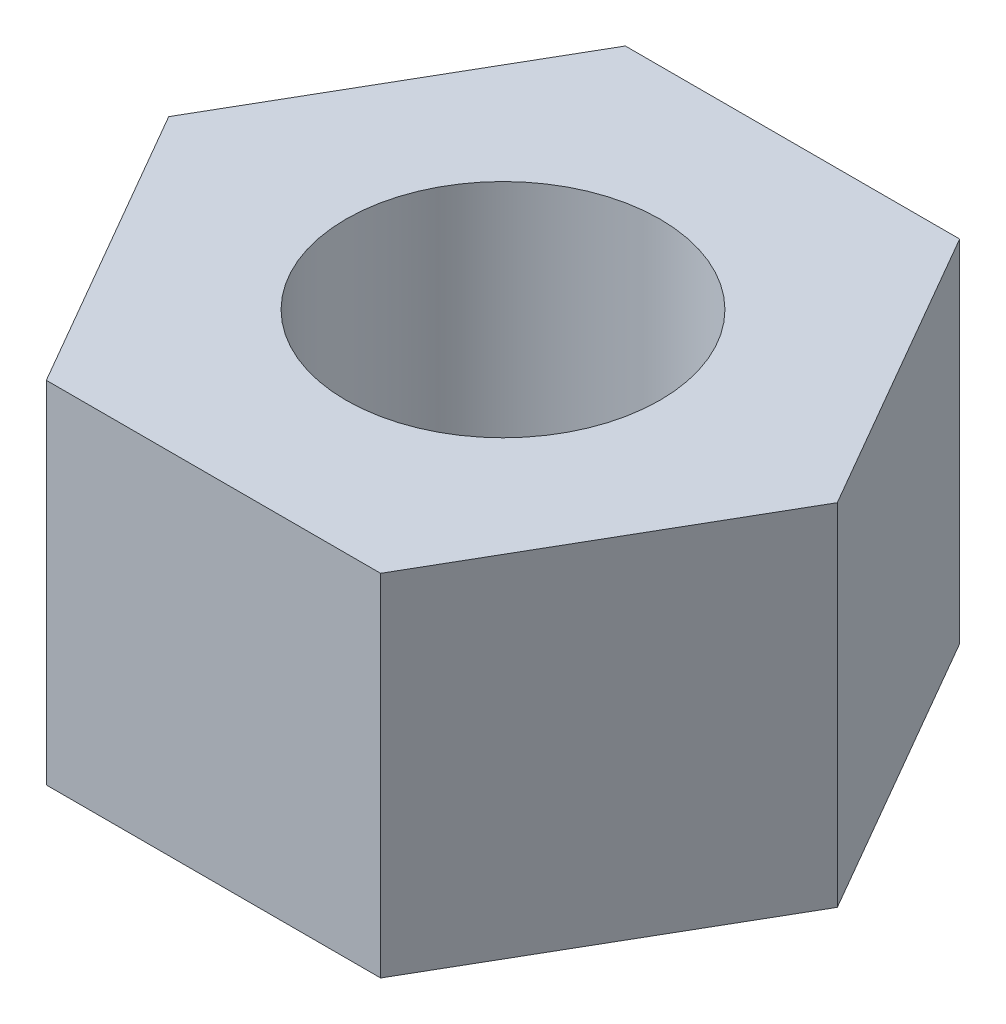
ISO-10303-21;
HEADER;
FILE_DESCRIPTION(('STEP AP214'),'2;1');
FILE_NAME('part.step','',(''),(''),'','','');
FILE_SCHEMA(('AUTOMOTIVE_DESIGN { 1 0 10303 214 1 1 1 1 }'));
ENDSEC;
DATA;
#1=APPLICATION_CONTEXT('core data for automotive mechanical design processes');
#2=APPLICATION_PROTOCOL_DEFINITION('international standard','automotive_design',2000,#1);
#3=PRODUCT_CONTEXT('',#1,'mechanical');
#4=PRODUCT('Part','Part','',(#3));
#5=PRODUCT_RELATED_PRODUCT_CATEGORY('part','',(#4));
#6=PRODUCT_DEFINITION_FORMATION('','',#4);
#7=PRODUCT_DEFINITION_CONTEXT('part definition',#1,'design');
#8=PRODUCT_DEFINITION('design','',#6,#7);
#9=PRODUCT_DEFINITION_SHAPE('','',#8);
#10=(LENGTH_UNIT() NAMED_UNIT(*) SI_UNIT(.MILLI.,.METRE.));
#11=(NAMED_UNIT(*) PLANE_ANGLE_UNIT() SI_UNIT($,.RADIAN.));
#12=(NAMED_UNIT(*) SI_UNIT($,.STERADIAN.) SOLID_ANGLE_UNIT());
#13=UNCERTAINTY_MEASURE_WITH_UNIT(LENGTH_MEASURE(1.E-05),#10,'distance_accuracy_value','');
#14=(GEOMETRIC_REPRESENTATION_CONTEXT(3) GLOBAL_UNCERTAINTY_ASSIGNED_CONTEXT((#13)) GLOBAL_UNIT_ASSIGNED_CONTEXT((#10,
#11,#12)) REPRESENTATION_CONTEXT('',''));
#15=CARTESIAN_POINT('',(0.,0.,0.));
#16=DIRECTION('',(0.,0.,1.));
#17=DIRECTION('',(1.,0.,0.));
#18=AXIS2_PLACEMENT_3D('',#15,#16,#17);
#19=CARTESIAN_POINT('',(0.,11.5,0.));
#20=DIRECTION('',(0.,1.,0.));
#21=DIRECTION('',(0.,0.,1.));
#22=AXIS2_PLACEMENT_3D('',#19,#20,#21);
#23=PLANE('',#22);
#24=DIRECTION('',(0.499999999999995,0.,-0.866025403784441));
#25=VECTOR('',#24,1.);
#26=CARTESIAN_POINT('',(5.48482755730154,11.5,9.4999999999999));
#27=LINE('',#26,#25);
#28=CARTESIAN_POINT('',(5.48482755730154,11.5,9.4999999999999));
#29=VERTEX_POINT('',#28);
#30=CARTESIAN_POINT('',(10.9696551146029,11.5,0.));
#31=VERTEX_POINT('',#30);
#32=EDGE_CURVE('E129',#29,#31,#27,.T.);
#33=ORIENTED_EDGE('',*,*,#32,.T.);
#34=DIRECTION('',(-0.500000000000001,0.,-0.866025403784438));
#35=VECTOR('',#34,1.);
#36=CARTESIAN_POINT('',(10.9696551146029,11.5,0.));
#37=LINE('',#36,#35);
#38=CARTESIAN_POINT('',(5.4848275573014,11.5,-9.49999999999998));
#39=VERTEX_POINT('',#38);
#40=EDGE_CURVE('E87',#31,#39,#37,.T.);
#41=ORIENTED_EDGE('',*,*,#40,.T.);
#42=DIRECTION('',(-1.,0.,0.));
#43=VECTOR('',#42,1.);
#44=CARTESIAN_POINT('',(5.4848275573014,11.5,-9.49999999999998));
#45=LINE('',#44,#43);
#46=CARTESIAN_POINT('',(-5.48482755730147,11.5,-9.49999999999994));
#47=VERTEX_POINT('',#46);
#48=EDGE_CURVE('E100',#39,#47,#45,.T.);
#49=ORIENTED_EDGE('',*,*,#48,.T.);
#50=DIRECTION('',(-0.499999999999995,0.,0.866025403784442));
#51=VECTOR('',#50,1.);
#52=CARTESIAN_POINT('',(-5.48482755730147,11.5,-9.49999999999994));
#53=LINE('',#52,#51);
#54=CARTESIAN_POINT('',(-10.9696551146028,11.5,0.));
#55=VERTEX_POINT('',#54);
#56=EDGE_CURVE('E94',#47,#55,#53,.T.);
#57=ORIENTED_EDGE('',*,*,#56,.T.);
#58=DIRECTION('',(0.500000000000007,0.,0.866025403784435));
#59=VECTOR('',#58,1.);
#60=CARTESIAN_POINT('',(-10.9696551146028,11.5,0.));
#61=LINE('',#60,#59);
#62=CARTESIAN_POINT('',(-5.48482755730134,11.5,9.50000000000002));
#63=VERTEX_POINT('',#62);
#64=EDGE_CURVE('E98',#55,#63,#61,.T.);
#65=ORIENTED_EDGE('',*,*,#64,.T.);
#66=DIRECTION('',(1.,0.,0.));
#67=VECTOR('',#66,1.);
#68=CARTESIAN_POINT('',(-5.48482755730134,11.5,9.50000000000002));
#69=LINE('',#68,#67);
#70=EDGE_CURVE('E50',#63,#29,#69,.T.);
#71=ORIENTED_EDGE('',*,*,#70,.T.);
#72=EDGE_LOOP('',(#33,#41,#49,#57,#65,#71));
#73=FACE_BOUND('',#72,.T.);
#74=CARTESIAN_POINT('',(0.,11.5,0.));
#75=DIRECTION('',(0.,1.,0.));
#76=DIRECTION('',(0.,0.,1.));
#77=AXIS2_PLACEMENT_3D('',#74,#75,#76);
#78=CIRCLE('',#77,5.15);
#79=CARTESIAN_POINT('',(0.,11.5,5.15));
#80=VERTEX_POINT('',#79);
#81=EDGE_CURVE('E122',#80,#80,#78,.T.);
#82=ORIENTED_EDGE('',*,*,#81,.F.);
#83=EDGE_LOOP('',(#82));
#84=FACE_BOUND('',#83,.T.);
#85=ADVANCED_FACE('F33',(#73,#84),#23,.T.);
#86=CARTESIAN_POINT('',(0.,0.,0.));
#87=DIRECTION('',(0.,1.,0.));
#88=DIRECTION('',(0.,0.,1.));
#89=AXIS2_PLACEMENT_3D('',#86,#87,#88);
#90=PLANE('',#89);
#91=DIRECTION('',(0.499999999999995,0.,-0.866025403784441));
#92=VECTOR('',#91,1.);
#93=CARTESIAN_POINT('',(5.48482755730154,0.,9.4999999999999));
#94=LINE('',#93,#92);
#95=CARTESIAN_POINT('',(5.48482755730154,0.,9.4999999999999));
#96=VERTEX_POINT('',#95);
#97=CARTESIAN_POINT('',(10.9696551146029,0.,0.));
#98=VERTEX_POINT('',#97);
#99=EDGE_CURVE('E118',#96,#98,#94,.T.);
#100=ORIENTED_EDGE('',*,*,#99,.F.);
#101=DIRECTION('',(1.,0.,0.));
#102=VECTOR('',#101,1.);
#103=CARTESIAN_POINT('',(-5.48482755730134,0.,9.50000000000002));
#104=LINE('',#103,#102);
#105=CARTESIAN_POINT('',(-5.48482755730134,0.,9.50000000000002));
#106=VERTEX_POINT('',#105);
#107=EDGE_CURVE('E79',#106,#96,#104,.T.);
#108=ORIENTED_EDGE('',*,*,#107,.F.);
#109=DIRECTION('',(0.500000000000007,0.,0.866025403784435));
#110=VECTOR('',#109,1.);
#111=CARTESIAN_POINT('',(-10.9696551146028,0.,0.));
#112=LINE('',#111,#110);
#113=CARTESIAN_POINT('',(-10.9696551146028,0.,0.));
#114=VERTEX_POINT('',#113);
#115=EDGE_CURVE('E73',#114,#106,#112,.T.);
#116=ORIENTED_EDGE('',*,*,#115,.F.);
#117=DIRECTION('',(-0.499999999999995,0.,0.866025403784442));
#118=VECTOR('',#117,1.);
#119=CARTESIAN_POINT('',(-5.48482755730147,0.,-9.49999999999994));
#120=LINE('',#119,#118);
#121=CARTESIAN_POINT('',(-5.48482755730147,0.,-9.49999999999994));
#122=VERTEX_POINT('',#121);
#123=EDGE_CURVE('E108',#122,#114,#120,.T.);
#124=ORIENTED_EDGE('',*,*,#123,.F.);
#125=DIRECTION('',(-1.,0.,0.));
#126=VECTOR('',#125,1.);
#127=CARTESIAN_POINT('',(5.4848275573014,0.,-9.49999999999998));
#128=LINE('',#127,#126);
#129=CARTESIAN_POINT('',(5.4848275573014,0.,-9.49999999999998));
#130=VERTEX_POINT('',#129);
#131=EDGE_CURVE('E124',#130,#122,#128,.T.);
#132=ORIENTED_EDGE('',*,*,#131,.F.);
#133=DIRECTION('',(-0.500000000000001,0.,-0.866025403784438));
#134=VECTOR('',#133,1.);
#135=CARTESIAN_POINT('',(10.9696551146029,0.,0.));
#136=LINE('',#135,#134);
#137=EDGE_CURVE('E121',#98,#130,#136,.T.);
#138=ORIENTED_EDGE('',*,*,#137,.F.);
#139=EDGE_LOOP('',(#100,#108,#116,#124,#132,#138));
#140=FACE_BOUND('',#139,.T.);
#141=CARTESIAN_POINT('',(0.,0.,0.));
#142=DIRECTION('',(0.,1.,0.));
#143=DIRECTION('',(0.,0.,1.));
#144=AXIS2_PLACEMENT_3D('',#141,#142,#143);
#145=CIRCLE('',#144,5.15);
#146=CARTESIAN_POINT('',(0.,0.,5.15));
#147=VERTEX_POINT('',#146);
#148=EDGE_CURVE('E222',#147,#147,#145,.T.);
#149=ORIENTED_EDGE('',*,*,#148,.T.);
#150=EDGE_LOOP('',(#149));
#151=FACE_BOUND('',#150,.T.);
#152=ADVANCED_FACE('F138',(#140,#151),#90,.F.);
#153=CARTESIAN_POINT('',(5.48482755730154,11.5,9.4999999999999));
#154=DIRECTION('',(-0.866025403784442,0.,-0.499999999999995));
#155=DIRECTION('',(-0.499999999999995,0.,0.866025403784442));
#156=AXIS2_PLACEMENT_3D('',#153,#154,#155);
#157=PLANE('',#156);
#158=ORIENTED_EDGE('',*,*,#99,.T.);
#159=DIRECTION('',(0.,-1.,0.));
#160=VECTOR('',#159,1.);
#161=CARTESIAN_POINT('',(10.9696551146029,11.5,0.));
#162=LINE('',#161,#160);
#163=EDGE_CURVE('E11',#31,#98,#162,.T.);
#164=ORIENTED_EDGE('',*,*,#163,.F.);
#165=ORIENTED_EDGE('',*,*,#32,.F.);
#166=DIRECTION('',(0.,-1.,0.));
#167=VECTOR('',#166,1.);
#168=CARTESIAN_POINT('',(5.48482755730154,11.5,9.4999999999999));
#169=LINE('',#168,#167);
#170=EDGE_CURVE('E114',#29,#96,#169,.T.);
#171=ORIENTED_EDGE('',*,*,#170,.T.);
#172=EDGE_LOOP('',(#158,#164,#165,#171));
#173=FACE_BOUND('',#172,.T.);
#174=ADVANCED_FACE('F35',(#173),#157,.F.);
#175=CARTESIAN_POINT('',(10.9696551146029,11.5,0.));
#176=DIRECTION('',(-0.866025403784438,0.,0.500000000000001));
#177=DIRECTION('',(0.500000000000001,0.,0.866025403784438));
#178=AXIS2_PLACEMENT_3D('',#175,#176,#177);
#179=PLANE('',#178);
#180=ORIENTED_EDGE('',*,*,#137,.T.);
#181=DIRECTION('',(0.,-1.,0.));
#182=VECTOR('',#181,1.);
#183=CARTESIAN_POINT('',(5.4848275573014,11.5,-9.49999999999998));
#184=LINE('',#183,#182);
#185=EDGE_CURVE('E42',#39,#130,#184,.T.);
#186=ORIENTED_EDGE('',*,*,#185,.F.);
#187=ORIENTED_EDGE('',*,*,#40,.F.);
#188=ORIENTED_EDGE('',*,*,#163,.T.);
#189=EDGE_LOOP('',(#180,#186,#187,#188));
#190=FACE_BOUND('',#189,.T.);
#191=ADVANCED_FACE('F163',(#190),#179,.F.);
#192=CARTESIAN_POINT('',(5.4848275573014,11.5,-9.49999999999998));
#193=DIRECTION('',(0.,0.,1.));
#194=DIRECTION('',(1.,0.,0.));
#195=AXIS2_PLACEMENT_3D('',#192,#193,#194);
#196=PLANE('',#195);
#197=ORIENTED_EDGE('',*,*,#131,.T.);
#198=DIRECTION('',(0.,-1.,0.));
#199=VECTOR('',#198,1.);
#200=CARTESIAN_POINT('',(-5.48482755730147,11.5,-9.49999999999994));
#201=LINE('',#200,#199);
#202=EDGE_CURVE('E109',#47,#122,#201,.T.);
#203=ORIENTED_EDGE('',*,*,#202,.F.);
#204=ORIENTED_EDGE('',*,*,#48,.F.);
#205=ORIENTED_EDGE('',*,*,#185,.T.);
#206=EDGE_LOOP('',(#197,#203,#204,#205));
#207=FACE_BOUND('',#206,.T.);
#208=ADVANCED_FACE('F135',(#207),#196,.F.);
#209=CARTESIAN_POINT('',(-5.48482755730147,11.5,-9.49999999999994));
#210=DIRECTION('',(0.866025403784442,0.,0.499999999999995));
#211=DIRECTION('',(0.499999999999995,0.,-0.866025403784442));
#212=AXIS2_PLACEMENT_3D('',#209,#210,#211);
#213=PLANE('',#212);
#214=ORIENTED_EDGE('',*,*,#123,.T.);
#215=DIRECTION('',(0.,-1.,0.));
#216=VECTOR('',#215,1.);
#217=CARTESIAN_POINT('',(-10.9696551146028,11.5,0.));
#218=LINE('',#217,#216);
#219=EDGE_CURVE('E105',#55,#114,#218,.T.);
#220=ORIENTED_EDGE('',*,*,#219,.F.);
#221=ORIENTED_EDGE('',*,*,#56,.F.);
#222=ORIENTED_EDGE('',*,*,#202,.T.);
#223=EDGE_LOOP('',(#214,#220,#221,#222));
#224=FACE_BOUND('',#223,.T.);
#225=ADVANCED_FACE('F106',(#224),#213,.F.);
#226=CARTESIAN_POINT('',(-10.9696551146028,11.5,0.));
#227=DIRECTION('',(0.866025403784435,0.,-0.500000000000007));
#228=DIRECTION('',(-0.500000000000007,0.,-0.866025403784435));
#229=AXIS2_PLACEMENT_3D('',#226,#227,#228);
#230=PLANE('',#229);
#231=ORIENTED_EDGE('',*,*,#115,.T.);
#232=DIRECTION('',(0.,-1.,0.));
#233=VECTOR('',#232,1.);
#234=CARTESIAN_POINT('',(-5.48482755730134,11.5,9.50000000000002));
#235=LINE('',#234,#233);
#236=EDGE_CURVE('E110',#63,#106,#235,.T.);
#237=ORIENTED_EDGE('',*,*,#236,.F.);
#238=ORIENTED_EDGE('',*,*,#64,.F.);
#239=ORIENTED_EDGE('',*,*,#219,.T.);
#240=EDGE_LOOP('',(#231,#237,#238,#239));
#241=FACE_BOUND('',#240,.T.);
#242=ADVANCED_FACE('F112',(#241),#230,.F.);
#243=CARTESIAN_POINT('',(-5.48482755730134,11.5,9.50000000000002));
#244=DIRECTION('',(0.,0.,-1.));
#245=DIRECTION('',(-1.,0.,0.));
#246=AXIS2_PLACEMENT_3D('',#243,#244,#245);
#247=PLANE('',#246);
#248=ORIENTED_EDGE('',*,*,#107,.T.);
#249=ORIENTED_EDGE('',*,*,#170,.F.);
#250=ORIENTED_EDGE('',*,*,#70,.F.);
#251=ORIENTED_EDGE('',*,*,#236,.T.);
#252=EDGE_LOOP('',(#248,#249,#250,#251));
#253=FACE_BOUND('',#252,.T.);
#254=ADVANCED_FACE('F143',(#253),#247,.F.);
#255=CARTESIAN_POINT('',(0.,11.5,0.));
#256=DIRECTION('',(0.,-1.,0.));
#257=DIRECTION('',(0.,0.,-1.));
#258=AXIS2_PLACEMENT_3D('',#255,#256,#257);
#259=CYLINDRICAL_SURFACE('',#258,5.15);
#260=ORIENTED_EDGE('',*,*,#81,.T.);
#261=EDGE_LOOP('',(#260));
#262=FACE_BOUND('',#261,.T.);
#263=ORIENTED_EDGE('',*,*,#148,.F.);
#264=EDGE_LOOP('',(#263));
#265=FACE_BOUND('',#264,.T.);
#266=ADVANCED_FACE('F145',(#262,#265),#259,.F.);
#267=CLOSED_SHELL('',(#85,#152,#174,#191,#208,#225,#242,#254,#266));
#268=MANIFOLD_SOLID_BREP('B2',#267);
#269=ADVANCED_BREP_SHAPE_REPRESENTATION('',(#18,#268),#14);
#270=SHAPE_DEFINITION_REPRESENTATION(#9,#269);
ENDSEC;
END-ISO-10303-21;
